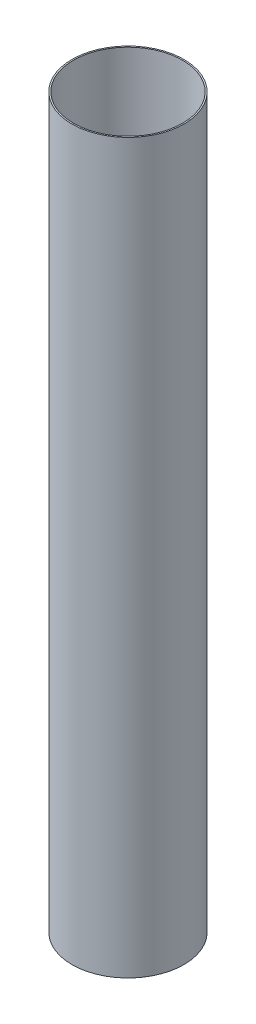
ISO-10303-21;
HEADER;
FILE_DESCRIPTION(('STEP AP214'),'2;1');
FILE_NAME('part.step','',(''),(''),'','','');
FILE_SCHEMA(('AUTOMOTIVE_DESIGN { 1 0 10303 214 1 1 1 1 }'));
ENDSEC;
DATA;
#1=APPLICATION_CONTEXT('core data for automotive mechanical design processes');
#2=APPLICATION_PROTOCOL_DEFINITION('international standard','automotive_design',2000,#1);
#3=PRODUCT_CONTEXT('',#1,'mechanical');
#4=PRODUCT('Part','Part','',(#3));
#5=PRODUCT_RELATED_PRODUCT_CATEGORY('part','',(#4));
#6=PRODUCT_DEFINITION_FORMATION('','',#4);
#7=PRODUCT_DEFINITION_CONTEXT('part definition',#1,'design');
#8=PRODUCT_DEFINITION('design','',#6,#7);
#9=PRODUCT_DEFINITION_SHAPE('','',#8);
#10=(LENGTH_UNIT() NAMED_UNIT(*) SI_UNIT(.MILLI.,.METRE.));
#11=(NAMED_UNIT(*) PLANE_ANGLE_UNIT() SI_UNIT($,.RADIAN.));
#12=(NAMED_UNIT(*) SI_UNIT($,.STERADIAN.) SOLID_ANGLE_UNIT());
#13=UNCERTAINTY_MEASURE_WITH_UNIT(LENGTH_MEASURE(1.E-05),#10,'distance_accuracy_value','');
#14=(GEOMETRIC_REPRESENTATION_CONTEXT(3) GLOBAL_UNCERTAINTY_ASSIGNED_CONTEXT((#13)) GLOBAL_UNIT_ASSIGNED_CONTEXT((#10,
#11,#12)) REPRESENTATION_CONTEXT('',''));
#15=CARTESIAN_POINT('',(0.,0.,0.));
#16=DIRECTION('',(0.,0.,1.));
#17=DIRECTION('',(1.,0.,0.));
#18=AXIS2_PLACEMENT_3D('',#15,#16,#17);
#19=CARTESIAN_POINT('',(0.,520.,0.));
#20=DIRECTION('',(0.,1.,0.));
#21=DIRECTION('',(0.,0.,1.));
#22=AXIS2_PLACEMENT_3D('',#19,#20,#21);
#23=PLANE('',#22);
#24=CARTESIAN_POINT('',(0.,520.,0.));
#25=DIRECTION('',(0.,1.,0.));
#26=DIRECTION('',(0.,0.,1.));
#27=AXIS2_PLACEMENT_3D('',#24,#25,#26);
#28=CIRCLE('',#27,40.);
#29=CARTESIAN_POINT('',(0.,520.,40.));
#30=VERTEX_POINT('',#29);
#31=EDGE_CURVE('E10',#30,#30,#28,.T.);
#32=ORIENTED_EDGE('',*,*,#31,.T.);
#33=EDGE_LOOP('',(#32));
#34=FACE_BOUND('',#33,.T.);
#35=CARTESIAN_POINT('',(0.,520.,0.));
#36=DIRECTION('',(0.,1.,0.));
#37=DIRECTION('',(0.,0.,1.));
#38=AXIS2_PLACEMENT_3D('',#35,#36,#37);
#39=CIRCLE('',#38,39.);
#40=CARTESIAN_POINT('',(0.,520.,39.));
#41=VERTEX_POINT('',#40);
#42=EDGE_CURVE('E48',#41,#41,#39,.T.);
#43=ORIENTED_EDGE('',*,*,#42,.F.);
#44=EDGE_LOOP('',(#43));
#45=FACE_BOUND('',#44,.T.);
#46=ADVANCED_FACE('F37',(#34,#45),#23,.T.);
#47=CARTESIAN_POINT('',(0.,0.,0.));
#48=DIRECTION('',(0.,1.,0.));
#49=DIRECTION('',(0.,0.,1.));
#50=AXIS2_PLACEMENT_3D('',#47,#48,#49);
#51=PLANE('',#50);
#52=CARTESIAN_POINT('',(0.,0.,0.));
#53=DIRECTION('',(0.,1.,0.));
#54=DIRECTION('',(0.,0.,1.));
#55=AXIS2_PLACEMENT_3D('',#52,#53,#54);
#56=CIRCLE('',#55,40.);
#57=CARTESIAN_POINT('',(0.,0.,40.));
#58=VERTEX_POINT('',#57);
#59=EDGE_CURVE('E41',#58,#58,#56,.T.);
#60=ORIENTED_EDGE('',*,*,#59,.F.);
#61=EDGE_LOOP('',(#60));
#62=FACE_BOUND('',#61,.T.);
#63=CARTESIAN_POINT('',(0.,0.,0.));
#64=DIRECTION('',(0.,1.,0.));
#65=DIRECTION('',(0.,0.,1.));
#66=AXIS2_PLACEMENT_3D('',#63,#64,#65);
#67=CIRCLE('',#66,39.);
#68=CARTESIAN_POINT('',(0.,0.,39.));
#69=VERTEX_POINT('',#68);
#70=EDGE_CURVE('E50',#69,#69,#67,.T.);
#71=ORIENTED_EDGE('',*,*,#70,.T.);
#72=EDGE_LOOP('',(#71));
#73=FACE_BOUND('',#72,.T.);
#74=ADVANCED_FACE('F60',(#62,#73),#51,.F.);
#75=CARTESIAN_POINT('',(0.,520.,0.));
#76=DIRECTION('',(0.,-1.,0.));
#77=DIRECTION('',(0.,0.,-1.));
#78=AXIS2_PLACEMENT_3D('',#75,#76,#77);
#79=CYLINDRICAL_SURFACE('',#78,40.);
#80=ORIENTED_EDGE('',*,*,#31,.F.);
#81=EDGE_LOOP('',(#80));
#82=FACE_BOUND('',#81,.T.);
#83=ORIENTED_EDGE('',*,*,#59,.T.);
#84=EDGE_LOOP('',(#83));
#85=FACE_BOUND('',#84,.T.);
#86=ADVANCED_FACE('F39',(#82,#85),#79,.T.);
#87=CARTESIAN_POINT('',(0.,520.,0.));
#88=DIRECTION('',(0.,-1.,0.));
#89=DIRECTION('',(0.,0.,-1.));
#90=AXIS2_PLACEMENT_3D('',#87,#88,#89);
#91=CYLINDRICAL_SURFACE('',#90,39.);
#92=ORIENTED_EDGE('',*,*,#42,.T.);
#93=EDGE_LOOP('',(#92));
#94=FACE_BOUND('',#93,.T.);
#95=ORIENTED_EDGE('',*,*,#70,.F.);
#96=EDGE_LOOP('',(#95));
#97=FACE_BOUND('',#96,.T.);
#98=ADVANCED_FACE('F56',(#94,#97),#91,.F.);
#99=CLOSED_SHELL('',(#46,#74,#86,#98));
#100=MANIFOLD_SOLID_BREP('B2',#99);
#101=ADVANCED_BREP_SHAPE_REPRESENTATION('',(#18,#100),#14);
#102=SHAPE_DEFINITION_REPRESENTATION(#9,#101);
ENDSEC;
END-ISO-10303-21;
